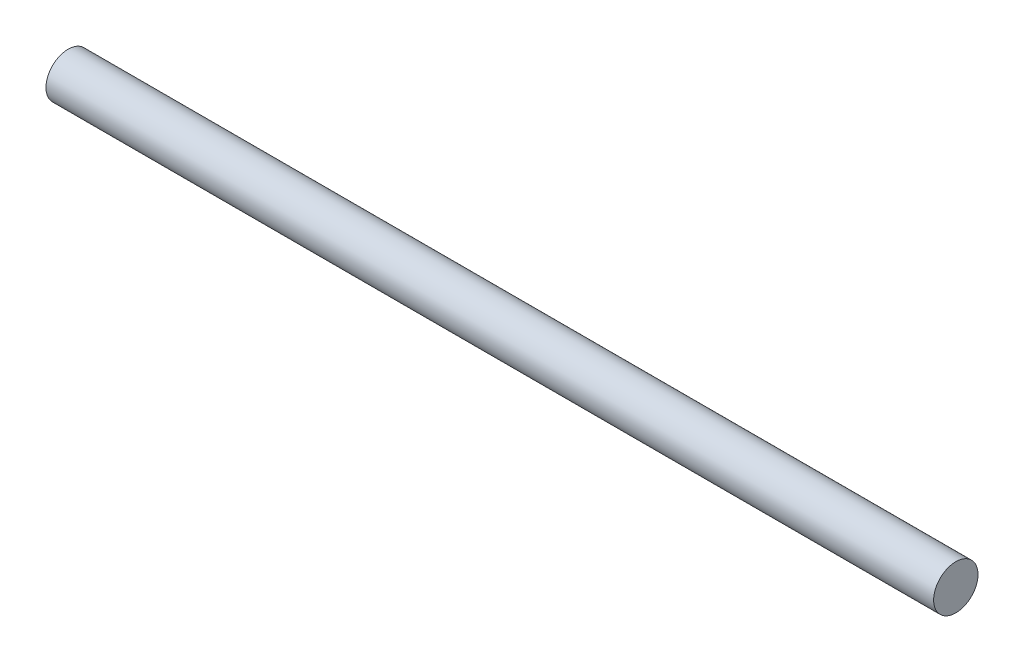
ISO-10303-21;
HEADER;
FILE_DESCRIPTION(('STEP AP214'),'2;1');
FILE_NAME('part.step','',(''),(''),'','','');
FILE_SCHEMA(('AUTOMOTIVE_DESIGN { 1 0 10303 214 1 1 1 1 }'));
ENDSEC;
DATA;
#1=APPLICATION_CONTEXT('core data for automotive mechanical design processes');
#2=APPLICATION_PROTOCOL_DEFINITION('international standard','automotive_design',2000,#1);
#3=PRODUCT_CONTEXT('',#1,'mechanical');
#4=PRODUCT('Part','Part','',(#3));
#5=PRODUCT_RELATED_PRODUCT_CATEGORY('part','',(#4));
#6=PRODUCT_DEFINITION_FORMATION('','',#4);
#7=PRODUCT_DEFINITION_CONTEXT('part definition',#1,'design');
#8=PRODUCT_DEFINITION('design','',#6,#7);
#9=PRODUCT_DEFINITION_SHAPE('','',#8);
#10=(LENGTH_UNIT() NAMED_UNIT(*) SI_UNIT(.MILLI.,.METRE.));
#11=(NAMED_UNIT(*) PLANE_ANGLE_UNIT() SI_UNIT($,.RADIAN.));
#12=(NAMED_UNIT(*) SI_UNIT($,.STERADIAN.) SOLID_ANGLE_UNIT());
#13=UNCERTAINTY_MEASURE_WITH_UNIT(LENGTH_MEASURE(1.E-05),#10,'distance_accuracy_value','');
#14=(GEOMETRIC_REPRESENTATION_CONTEXT(3) GLOBAL_UNCERTAINTY_ASSIGNED_CONTEXT((#13)) GLOBAL_UNIT_ASSIGNED_CONTEXT((#10,
#11,#12)) REPRESENTATION_CONTEXT('',''));
#15=CARTESIAN_POINT('',(0.,0.,0.));
#16=DIRECTION('',(0.,0.,1.));
#17=DIRECTION('',(1.,0.,0.));
#18=AXIS2_PLACEMENT_3D('',#15,#16,#17);
#19=CARTESIAN_POINT('',(100.,0.,0.));
#20=DIRECTION('',(-1.,0.,0.));
#21=DIRECTION('',(0.,0.,1.));
#22=AXIS2_PLACEMENT_3D('',#19,#20,#21);
#23=CYLINDRICAL_SURFACE('',#22,2.5);
#24=CARTESIAN_POINT('',(100.,0.,0.));
#25=DIRECTION('',(1.,0.,0.));
#26=DIRECTION('',(0.,0.,-1.));
#27=AXIS2_PLACEMENT_3D('',#24,#25,#26);
#28=CIRCLE('',#27,2.5);
#29=CARTESIAN_POINT('',(100.,0.,-2.5));
#30=VERTEX_POINT('',#29);
#31=EDGE_CURVE('E10',#30,#30,#28,.T.);
#32=ORIENTED_EDGE('',*,*,#31,.F.);
#33=EDGE_LOOP('',(#32));
#34=FACE_BOUND('',#33,.T.);
#35=CARTESIAN_POINT('',(0.,0.,0.));
#36=DIRECTION('',(1.,0.,0.));
#37=DIRECTION('',(0.,0.,-1.));
#38=AXIS2_PLACEMENT_3D('',#35,#36,#37);
#39=CIRCLE('',#38,2.5);
#40=CARTESIAN_POINT('',(0.,0.,-2.5));
#41=VERTEX_POINT('',#40);
#42=EDGE_CURVE('E44',#41,#41,#39,.T.);
#43=ORIENTED_EDGE('',*,*,#42,.T.);
#44=EDGE_LOOP('',(#43));
#45=FACE_BOUND('',#44,.T.);
#46=ADVANCED_FACE('F41',(#34,#45),#23,.T.);
#47=CARTESIAN_POINT('',(100.,0.,0.));
#48=DIRECTION('',(1.,0.,0.));
#49=DIRECTION('',(0.,0.,-1.));
#50=AXIS2_PLACEMENT_3D('',#47,#48,#49);
#51=PLANE('',#50);
#52=ORIENTED_EDGE('',*,*,#31,.T.);
#53=EDGE_LOOP('',(#52));
#54=FACE_BOUND('',#53,.T.);
#55=ADVANCED_FACE('F58',(#54),#51,.T.);
#56=CARTESIAN_POINT('',(0.,0.,0.));
#57=DIRECTION('',(1.,0.,0.));
#58=DIRECTION('',(0.,0.,-1.));
#59=AXIS2_PLACEMENT_3D('',#56,#57,#58);
#60=PLANE('',#59);
#61=ORIENTED_EDGE('',*,*,#42,.F.);
#62=EDGE_LOOP('',(#61));
#63=FACE_BOUND('',#62,.T.);
#64=ADVANCED_FACE('F56',(#63),#60,.F.);
#65=CLOSED_SHELL('',(#46,#55,#64));
#66=MANIFOLD_SOLID_BREP('B2',#65);
#67=ADVANCED_BREP_SHAPE_REPRESENTATION('',(#18,#66),#14);
#68=SHAPE_DEFINITION_REPRESENTATION(#9,#67);
ENDSEC;
END-ISO-10303-21;
